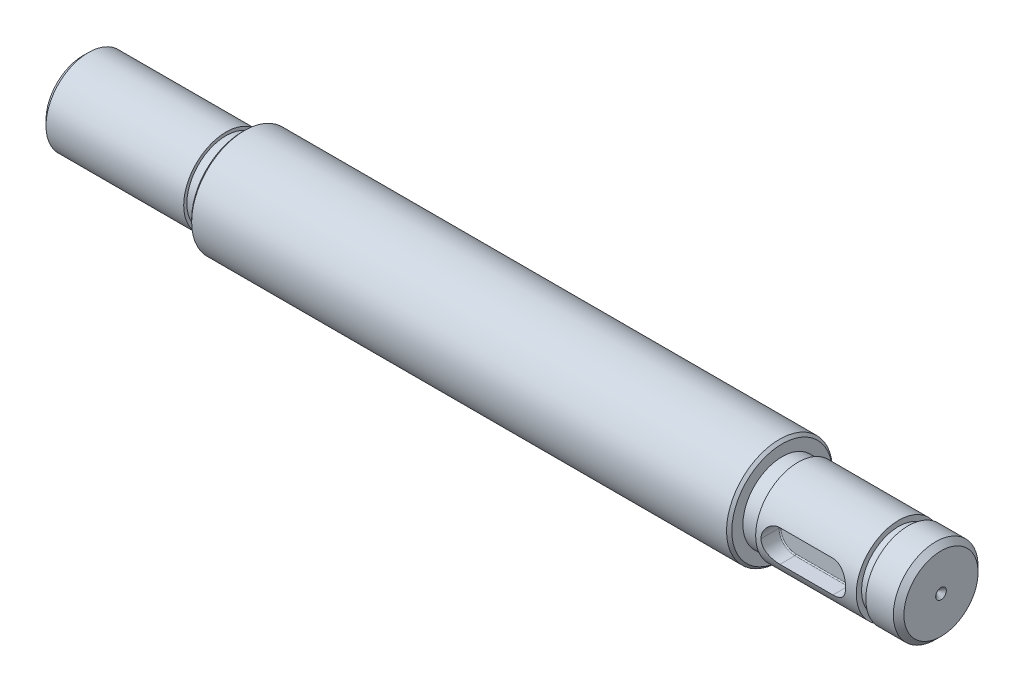
ISO-10303-21;
HEADER;
FILE_DESCRIPTION(('STEP AP214'),'2;1');
FILE_NAME('part.step','',(''),(''),'','','');
FILE_SCHEMA(('AUTOMOTIVE_DESIGN { 1 0 10303 214 1 1 1 1 }'));
ENDSEC;
DATA;
#1=APPLICATION_CONTEXT('core data for automotive mechanical design processes');
#2=APPLICATION_PROTOCOL_DEFINITION('international standard','automotive_design',2000,#1);
#3=PRODUCT_CONTEXT('',#1,'mechanical');
#4=PRODUCT('Part','Part','',(#3));
#5=PRODUCT_RELATED_PRODUCT_CATEGORY('part','',(#4));
#6=PRODUCT_DEFINITION_FORMATION('','',#4);
#7=PRODUCT_DEFINITION_CONTEXT('part definition',#1,'design');
#8=PRODUCT_DEFINITION('design','',#6,#7);
#9=PRODUCT_DEFINITION_SHAPE('','',#8);
#10=(LENGTH_UNIT() NAMED_UNIT(*) SI_UNIT(.MILLI.,.METRE.));
#11=(NAMED_UNIT(*) PLANE_ANGLE_UNIT() SI_UNIT($,.RADIAN.));
#12=(NAMED_UNIT(*) SI_UNIT($,.STERADIAN.) SOLID_ANGLE_UNIT());
#13=UNCERTAINTY_MEASURE_WITH_UNIT(LENGTH_MEASURE(1.E-05),#10,'distance_accuracy_value','');
#14=(GEOMETRIC_REPRESENTATION_CONTEXT(3) GLOBAL_UNCERTAINTY_ASSIGNED_CONTEXT((#13)) GLOBAL_UNIT_ASSIGNED_CONTEXT((#10,
#11,#12)) REPRESENTATION_CONTEXT('',''));
#15=CARTESIAN_POINT('',(0.,0.,0.));
#16=DIRECTION('',(0.,0.,1.));
#17=DIRECTION('',(1.,0.,0.));
#18=AXIS2_PLACEMENT_3D('',#15,#16,#17);
#19=CARTESIAN_POINT('',(0.,0.,0.));
#20=DIRECTION('',(-1.,0.,0.));
#21=DIRECTION('',(0.,0.,1.));
#22=AXIS2_PLACEMENT_3D('',#19,#20,#21);
#23=CYLINDRICAL_SURFACE('',#22,4.);
#24=CARTESIAN_POINT('',(77.,0.,0.));
#25=DIRECTION('',(1.,0.,0.));
#26=DIRECTION('',(0.,0.,-1.));
#27=AXIS2_PLACEMENT_3D('',#24,#25,#26);
#28=CIRCLE('',#27,4.);
#29=CARTESIAN_POINT('',(77.,0.,-4.));
#30=VERTEX_POINT('',#29);
#31=EDGE_CURVE('E365',#30,#30,#28,.T.);
#32=ORIENTED_EDGE('',*,*,#31,.F.);
#33=EDGE_LOOP('',(#32));
#34=FACE_BOUND('',#33,.T.);
#35=CARTESIAN_POINT('',(67.5,0.,0.));
#36=DIRECTION('',(-1.,0.,0.));
#37=DIRECTION('',(0.,0.,1.));
#38=AXIS2_PLACEMENT_3D('',#35,#36,#37);
#39=CIRCLE('',#38,4.);
#40=CARTESIAN_POINT('',(67.5,0.,4.));
#41=VERTEX_POINT('',#40);
#42=EDGE_CURVE('E302',#41,#41,#39,.T.);
#43=ORIENTED_EDGE('',*,*,#42,.F.);
#44=EDGE_LOOP('',(#43));
#45=FACE_BOUND('',#44,.T.);
#46=DIRECTION('',(-1.,0.,0.));
#47=VECTOR('',#46,1.);
#48=CARTESIAN_POINT('',(0.,-1.5,3.70809924354783));
#49=LINE('',#48,#47);
#50=CARTESIAN_POINT('',(74.5,-1.5,3.70809924354783));
#51=VERTEX_POINT('',#50);
#52=CARTESIAN_POINT('',(69.5,-1.5,3.70809924354783));
#53=VERTEX_POINT('',#52);
#54=EDGE_CURVE('E159',#51,#53,#49,.T.);
#55=ORIENTED_EDGE('',*,*,#54,.T.);
#56=CARTESIAN_POINT('',(69.5,-1.5,3.70809924354783));
#57=CARTESIAN_POINT('',(69.4594059305553,-1.50000149763685,3.70809443488223));
#58=CARTESIAN_POINT('',(69.4188329978994,-1.49835105709716,3.70876668409977));
#59=CARTESIAN_POINT('',(69.3380093568391,-1.49177843163965,3.71141698257091));
#60=CARTESIAN_POINT('',(69.2977585447945,-1.48685734569824,3.71339459320577));
#61=CARTESIAN_POINT('',(69.178226826317,-1.4672933482067,3.72119033682707));
#62=CARTESIAN_POINT('',(69.0997974497692,-1.44784901310297,3.72887225208868));
#63=CARTESIAN_POINT('',(68.9476339471668,-1.39690282812454,3.74825199333564));
#64=CARTESIAN_POINT('',(68.8738960111435,-1.3654109118427,3.75994650999365));
#65=CARTESIAN_POINT('',(68.7326690628725,-1.29134257885079,3.78602333377589));
#66=CARTESIAN_POINT('',(68.6651854708133,-1.24875666733343,3.80040794022651));
#67=CARTESIAN_POINT('',(68.5351088724607,-1.15146673631305,3.83103570457934));
#68=CARTESIAN_POINT('',(68.4728715264412,-1.09630444816551,3.84733331324471));
#69=CARTESIAN_POINT('',(68.3582775205832,-0.976395613097518,3.87949750401636));
#70=CARTESIAN_POINT('',(68.305923002106,-0.911646994469718,3.89536399207354));
#71=CARTESIAN_POINT('',(68.2108435774906,-0.771671110191599,3.92553400925355));
#72=CARTESIAN_POINT('',(68.1685118052143,-0.696160035999179,3.93976501267995));
#73=CARTESIAN_POINT('',(68.0973265968158,-0.538489868027632,3.9643883038365));
#74=CARTESIAN_POINT('',(68.0684589267465,-0.456337903183925,3.97478464304361));
#75=CARTESIAN_POINT('',(68.0313833692295,-0.311568360413164,3.98831063781509));
#76=CARTESIAN_POINT('',(68.0196498632232,-0.249946259701632,3.9926612104967));
#77=CARTESIAN_POINT('',(68.0039443418765,-0.125564806183785,3.99852089820637));
#78=CARTESIAN_POINT('',(67.9999755768709,-0.062804988216709,4.00002882328734));
#79=CARTESIAN_POINT('',(68.,0.,4.));
#80=B_SPLINE_CURVE_WITH_KNOTS('',3,(#56,#57,#58,#59,#60,#61,#62,#63,#64,#65,#66,#67,#68,#69,#70,
#71,#72,#73,#74,#75,#76,#77,#78,#79),.UNSPECIFIED.,.F.,.F.,(4,2,2,2,2,2,2,2,2,2,2,4),(0.,
0.121702070650527,0.243363268593937,0.485593089370354,0.727623613350256,0.969861963846899,
1.2229773776272,1.47614757238601,1.73802530937246,1.9996255640306,2.18773738057225,
2.37592792422954),.UNSPECIFIED.);
#81=CARTESIAN_POINT('',(68.,0.,4.));
#82=VERTEX_POINT('',#81);
#83=EDGE_CURVE('E214',#53,#82,#80,.T.);
#84=ORIENTED_EDGE('',*,*,#83,.T.);
#85=CARTESIAN_POINT('',(68.,0.,4.));
#86=CARTESIAN_POINT('',(67.9999987715417,0.0406958829842193,4.0000033265242));
#87=CARTESIAN_POINT('',(68.0016572436766,0.08137099541071,3.99937821643425));
#88=CARTESIAN_POINT('',(68.0082636148126,0.1624049821427,3.99690675065887));
#89=CARTESIAN_POINT('',(68.0132106231327,0.202763939083229,3.99506072565186));
#90=CARTESIAN_POINT('',(68.0328868689112,0.322658818153229,3.98776419542613));
#91=CARTESIAN_POINT('',(68.0524519115586,0.401351138250185,3.98055464040178));
#92=CARTESIAN_POINT('',(68.1037487278131,0.554057247937605,3.96219014943225));
#93=CARTESIAN_POINT('',(68.1354739160358,0.628073544622783,3.9510373492233));
#94=CARTESIAN_POINT('',(68.2100889205701,0.769768846215137,3.92589331480545));
#95=CARTESIAN_POINT('',(68.2529862089937,0.837443568408158,3.91190018231573));
#96=CARTESIAN_POINT('',(68.3506106720114,0.967344906860735,3.88186303805133));
#97=CARTESIAN_POINT('',(68.405725774499,1.02926635746347,3.86576126025821));
#98=CARTESIAN_POINT('',(68.5254061833372,1.14324026520414,3.83360332452306));
#99=CARTESIAN_POINT('',(68.5899750568823,1.19528897996651,3.8175471861438));
#100=CARTESIAN_POINT('',(68.7297458027433,1.2900021675008,3.78661824913521));
#101=CARTESIAN_POINT('',(68.805261304648,1.3322282773455,3.77181479391607));
#102=CARTESIAN_POINT('',(68.9629257096993,1.40321260233322,3.74598828763861));
#103=CARTESIAN_POINT('',(69.0450662174502,1.43198755826084,3.73496054207913));
#104=CARTESIAN_POINT('',(69.1895938732748,1.4688507799066,3.72058587751726));
#105=CARTESIAN_POINT('',(69.250966567495,1.4804930770667,3.71594709538589));
#106=CARTESIAN_POINT('',(69.3748756822457,1.49608314541372,3.7096837811096));
#107=CARTESIAN_POINT('',(69.4374129386371,1.50002515651037,3.70806150546337));
#108=CARTESIAN_POINT('',(69.5,1.5,3.70809924354783));
#109=B_SPLINE_CURVE_WITH_KNOTS('',3,(#85,#86,#87,#88,#89,#90,#91,#92,#93,#94,#95,#96,#97,#98,
#99,#100,#101,#102,#103,#104,#105,#106,#107,#108),.UNSPECIFIED.,.F.,.F.,(4,2,2,2,2,2,2,2,2,2,2,
4),(0.,0.122008525653371,0.243984019459629,0.486933412549048,0.729751420715084,
0.972732249088057,1.2249558748475,1.47727491867927,1.73930674597636,2.0010115846268,
2.18839922255605,2.37592697956525),.UNSPECIFIED.);
#110=CARTESIAN_POINT('',(69.5,1.5,3.70809924354783));
#111=VERTEX_POINT('',#110);
#112=EDGE_CURVE('E208',#82,#111,#109,.T.);
#113=ORIENTED_EDGE('',*,*,#112,.T.);
#114=DIRECTION('',(-1.,0.,0.));
#115=VECTOR('',#114,1.);
#116=CARTESIAN_POINT('',(0.,1.5,3.70809924354783));
#117=LINE('',#116,#115);
#118=CARTESIAN_POINT('',(74.5,1.5,3.70809924354783));
#119=VERTEX_POINT('',#118);
#120=EDGE_CURVE('E162',#111,#119,#117,.F.);
#121=ORIENTED_EDGE('',*,*,#120,.T.);
#122=CARTESIAN_POINT('',(74.5,1.5,3.70809924354783));
#123=CARTESIAN_POINT('',(74.5405940694447,1.50000149763685,3.70809443488223));
#124=CARTESIAN_POINT('',(74.5811670021006,1.49835105709716,3.70876668409977));
#125=CARTESIAN_POINT('',(74.6619906431609,1.49177843163965,3.71141698257091));
#126=CARTESIAN_POINT('',(74.7022414552056,1.48685734569824,3.71339459320577));
#127=CARTESIAN_POINT('',(74.821773173683,1.4672933482067,3.72119033682707));
#128=CARTESIAN_POINT('',(74.9002025502308,1.44784901310297,3.72887225208868));
#129=CARTESIAN_POINT('',(75.0523660528332,1.39690282812453,3.74825199333564));
#130=CARTESIAN_POINT('',(75.1261039888565,1.36541091184269,3.75994650999366));
#131=CARTESIAN_POINT('',(75.2673309371275,1.29134257885079,3.7860233337759));
#132=CARTESIAN_POINT('',(75.3348145291867,1.24875666733342,3.80040794022651));
#133=CARTESIAN_POINT('',(75.4648911275393,1.15146673631305,3.83103570457934));
#134=CARTESIAN_POINT('',(75.5271284735588,1.09630444816551,3.84733331324471));
#135=CARTESIAN_POINT('',(75.6417224794168,0.976395613097518,3.87949750401636));
#136=CARTESIAN_POINT('',(75.694076997894,0.911646994469717,3.89536399207354));
#137=CARTESIAN_POINT('',(75.7891564225094,0.771671110191596,3.92553400925355));
#138=CARTESIAN_POINT('',(75.8314881947857,0.696160035999174,3.93976501267995));
#139=CARTESIAN_POINT('',(75.9026734031842,0.538489868027627,3.9643883038365));
#140=CARTESIAN_POINT('',(75.9315410732535,0.456337903183921,3.97478464304361));
#141=CARTESIAN_POINT('',(75.9686166307705,0.311568360413164,3.98831063781509));
#142=CARTESIAN_POINT('',(75.9803501367768,0.249946259701633,3.9926612104967));
#143=CARTESIAN_POINT('',(75.9960556581235,0.125564806183786,3.99852089820637));
#144=CARTESIAN_POINT('',(76.0000244231291,0.0628049882167101,4.00002882328734));
#145=CARTESIAN_POINT('',(76.,0.,4.));
#146=B_SPLINE_CURVE_WITH_KNOTS('',3,(#122,#123,#124,#125,#126,#127,#128,#129,#130,#131,#132,
#133,#134,#135,#136,#137,#138,#139,#140,#141,#142,#143,#144,#145),.UNSPECIFIED.,.F.,.F.,(4,2,2,
2,2,2,2,2,2,2,2,4),(0.,0.12170207065054,0.243363268593951,0.485593089370354,0.727623613350272,
0.969861963846899,1.2229773776272,1.47614757238601,1.73802530937248,1.9996255640306,
2.18773738057225,2.37592792422954),.UNSPECIFIED.);
#147=CARTESIAN_POINT('',(76.,0.,4.));
#148=VERTEX_POINT('',#147);
#149=EDGE_CURVE('E169',#119,#148,#146,.T.);
#150=ORIENTED_EDGE('',*,*,#149,.T.);
#151=CARTESIAN_POINT('',(76.,0.,4.));
#152=CARTESIAN_POINT('',(76.0000012284583,-0.0406958829842188,4.0000033265242));
#153=CARTESIAN_POINT('',(75.9983427563234,-0.081370995410709,3.99937821643425));
#154=CARTESIAN_POINT('',(75.9917363851874,-0.162404982142699,3.99690675065887));
#155=CARTESIAN_POINT('',(75.9867893768673,-0.202763939083229,3.99506072565186));
#156=CARTESIAN_POINT('',(75.9671131310888,-0.322658818153229,3.98776419542613));
#157=CARTESIAN_POINT('',(75.9475480884414,-0.401351138250185,3.98055464040178));
#158=CARTESIAN_POINT('',(75.8962512721869,-0.554057247937611,3.96219014943225));
#159=CARTESIAN_POINT('',(75.8645260839642,-0.628073544622794,3.9510373492233));
#160=CARTESIAN_POINT('',(75.7899110794299,-0.769768846215147,3.92589331480545));
#161=CARTESIAN_POINT('',(75.7470137910063,-0.837443568408164,3.91190018231573));
#162=CARTESIAN_POINT('',(75.6493893279886,-0.967344906860733,3.88186303805133));
#163=CARTESIAN_POINT('',(75.594274225501,-1.02926635746347,3.86576126025821));
#164=CARTESIAN_POINT('',(75.4745938166628,-1.14324026520414,3.83360332452306));
#165=CARTESIAN_POINT('',(75.4100249431177,-1.19528897996651,3.8175471861438));
#166=CARTESIAN_POINT('',(75.2702541972567,-1.2900021675008,3.78661824913521));
#167=CARTESIAN_POINT('',(75.194738695352,-1.3322282773455,3.77181479391607));
#168=CARTESIAN_POINT('',(75.0370742903007,-1.40321260233322,3.74598828763861));
#169=CARTESIAN_POINT('',(74.9549337825498,-1.43198755826084,3.73496054207913));
#170=CARTESIAN_POINT('',(74.8104061267252,-1.4688507799066,3.72058587751726));
#171=CARTESIAN_POINT('',(74.749033432505,-1.4804930770667,3.71594709538589));
#172=CARTESIAN_POINT('',(74.6251243177543,-1.49608314541372,3.7096837811096));
#173=CARTESIAN_POINT('',(74.5625870613629,-1.50002515651037,3.70806150546337));
#174=CARTESIAN_POINT('',(74.5,-1.5,3.70809924354783));
#175=B_SPLINE_CURVE_WITH_KNOTS('',3,(#151,#152,#153,#154,#155,#156,#157,#158,#159,#160,#161,
#162,#163,#164,#165,#166,#167,#168,#169,#170,#171,#172,#173,#174),.UNSPECIFIED.,.F.,.F.,(4,2,2,
2,2,2,2,2,2,2,2,4),(0.,0.12200852565337,0.243984019459629,0.486933412549048,0.729751420715105,
0.972732249088057,1.2249558748475,1.47727491867927,1.73930674597636,2.0010115846268,
2.18839922255604,2.37592697956525),.UNSPECIFIED.);
#176=EDGE_CURVE('E177',#148,#51,#175,.T.);
#177=ORIENTED_EDGE('',*,*,#176,.T.);
#178=EDGE_LOOP('',(#55,#84,#113,#121,#150,#177));
#179=FACE_BOUND('',#178,.T.);
#180=ADVANCED_FACE('F38',(#34,#45,#179),#23,.T.);
#181=CARTESIAN_POINT('',(66.,4.75,0.));
#182=DIRECTION('',(-1.,0.,0.));
#183=DIRECTION('',(0.,0.,1.));
#184=AXIS2_PLACEMENT_3D('',#181,#182,#183);
#185=PLANE('',#184);
#186=CARTESIAN_POINT('',(66.,0.,0.));
#187=DIRECTION('',(-1.,0.,0.));
#188=DIRECTION('',(0.,0.,1.));
#189=AXIS2_PLACEMENT_3D('',#186,#187,#188);
#190=CIRCLE('',#189,4.75);
#191=CARTESIAN_POINT('',(66.,0.,4.75));
#192=VERTEX_POINT('',#191);
#193=EDGE_CURVE('E144',#192,#192,#190,.T.);
#194=ORIENTED_EDGE('',*,*,#193,.F.);
#195=EDGE_LOOP('',(#194));
#196=FACE_BOUND('',#195,.T.);
#197=CARTESIAN_POINT('',(66.,0.,0.));
#198=DIRECTION('',(-1.,0.,0.));
#199=DIRECTION('',(0.,0.,1.));
#200=AXIS2_PLACEMENT_3D('',#197,#198,#199);
#201=CIRCLE('',#200,3.7);
#202=CARTESIAN_POINT('',(66.,0.,3.7));
#203=VERTEX_POINT('',#202);
#204=EDGE_CURVE('E309',#203,#203,#201,.T.);
#205=ORIENTED_EDGE('',*,*,#204,.T.);
#206=EDGE_LOOP('',(#205));
#207=FACE_BOUND('',#206,.T.);
#208=ADVANCED_FACE('F341',(#196,#207),#185,.F.);
#209=CARTESIAN_POINT('',(66.,0.,0.));
#210=DIRECTION('',(-1.,0.,0.));
#211=DIRECTION('',(0.,0.,1.));
#212=AXIS2_PLACEMENT_3D('',#209,#210,#211);
#213=CONICAL_SURFACE('',#212,4.75,0.785398163397448);
#214=CARTESIAN_POINT('',(65.75,0.,0.));
#215=DIRECTION('',(-1.,0.,0.));
#216=DIRECTION('',(0.,0.,1.));
#217=AXIS2_PLACEMENT_3D('',#214,#215,#216);
#218=CIRCLE('',#217,5.);
#219=CARTESIAN_POINT('',(65.75,0.,5.));
#220=VERTEX_POINT('',#219);
#221=EDGE_CURVE('E141',#220,#220,#218,.T.);
#222=ORIENTED_EDGE('',*,*,#221,.F.);
#223=EDGE_LOOP('',(#222));
#224=FACE_BOUND('',#223,.T.);
#225=ORIENTED_EDGE('',*,*,#193,.T.);
#226=EDGE_LOOP('',(#225));
#227=FACE_BOUND('',#226,.T.);
#228=ADVANCED_FACE('F346',(#224,#227),#213,.T.);
#229=CARTESIAN_POINT('',(0.,0.,0.));
#230=DIRECTION('',(-1.,0.,0.));
#231=DIRECTION('',(0.,0.,1.));
#232=AXIS2_PLACEMENT_3D('',#229,#230,#231);
#233=CYLINDRICAL_SURFACE('',#232,5.);
#234=CARTESIAN_POINT('',(15.25,0.,0.));
#235=DIRECTION('',(-1.,0.,0.));
#236=DIRECTION('',(0.,0.,1.));
#237=AXIS2_PLACEMENT_3D('',#234,#235,#236);
#238=CIRCLE('',#237,5.);
#239=CARTESIAN_POINT('',(15.25,0.,5.));
#240=VERTEX_POINT('',#239);
#241=EDGE_CURVE('E138',#240,#240,#238,.T.);
#242=ORIENTED_EDGE('',*,*,#241,.F.);
#243=EDGE_LOOP('',(#242));
#244=FACE_BOUND('',#243,.T.);
#245=ORIENTED_EDGE('',*,*,#221,.T.);
#246=EDGE_LOOP('',(#245));
#247=FACE_BOUND('',#246,.T.);
#248=ADVANCED_FACE('F336',(#244,#247),#233,.T.);
#249=CARTESIAN_POINT('',(15.25,0.,0.));
#250=DIRECTION('',(1.,0.,0.));
#251=DIRECTION('',(0.,0.,-1.));
#252=AXIS2_PLACEMENT_3D('',#249,#250,#251);
#253=CONICAL_SURFACE('',#252,5.,0.785398163397448);
#254=CARTESIAN_POINT('',(15.,0.,0.));
#255=DIRECTION('',(-1.,0.,0.));
#256=DIRECTION('',(0.,0.,1.));
#257=AXIS2_PLACEMENT_3D('',#254,#255,#256);
#258=CIRCLE('',#257,4.75);
#259=CARTESIAN_POINT('',(15.,0.,4.75));
#260=VERTEX_POINT('',#259);
#261=EDGE_CURVE('E129',#260,#260,#258,.T.);
#262=ORIENTED_EDGE('',*,*,#261,.F.);
#263=EDGE_LOOP('',(#262));
#264=FACE_BOUND('',#263,.T.);
#265=ORIENTED_EDGE('',*,*,#241,.T.);
#266=EDGE_LOOP('',(#265));
#267=FACE_BOUND('',#266,.T.);
#268=ADVANCED_FACE('F327',(#264,#267),#253,.T.);
#269=CARTESIAN_POINT('',(15.,4.,0.));
#270=DIRECTION('',(1.,0.,0.));
#271=DIRECTION('',(0.,0.,-1.));
#272=AXIS2_PLACEMENT_3D('',#269,#270,#271);
#273=PLANE('',#272);
#274=ORIENTED_EDGE('',*,*,#261,.T.);
#275=EDGE_LOOP('',(#274));
#276=FACE_BOUND('',#275,.T.);
#277=CARTESIAN_POINT('',(15.,0.,0.));
#278=DIRECTION('',(-1.,0.,0.));
#279=DIRECTION('',(0.,0.,1.));
#280=AXIS2_PLACEMENT_3D('',#277,#278,#279);
#281=CIRCLE('',#280,3.7);
#282=CARTESIAN_POINT('',(15.,0.,3.7));
#283=VERTEX_POINT('',#282);
#284=EDGE_CURVE('E132',#283,#283,#281,.T.);
#285=ORIENTED_EDGE('',*,*,#284,.F.);
#286=EDGE_LOOP('',(#285));
#287=FACE_BOUND('',#286,.T.);
#288=ADVANCED_FACE('F324',(#276,#287),#273,.F.);
#289=CARTESIAN_POINT('',(13.5,4.,0.));
#290=DIRECTION('',(1.,0.,0.));
#291=DIRECTION('',(0.,0.,-1.));
#292=AXIS2_PLACEMENT_3D('',#289,#290,#291);
#293=PLANE('',#292);
#294=CARTESIAN_POINT('',(13.5,0.,0.));
#295=DIRECTION('',(-1.,0.,0.));
#296=DIRECTION('',(0.,0.,1.));
#297=AXIS2_PLACEMENT_3D('',#294,#295,#296);
#298=CIRCLE('',#297,3.7);
#299=CARTESIAN_POINT('',(13.5,0.,3.7));
#300=VERTEX_POINT('',#299);
#301=EDGE_CURVE('E126',#300,#300,#298,.T.);
#302=ORIENTED_EDGE('',*,*,#301,.T.);
#303=EDGE_LOOP('',(#302));
#304=FACE_BOUND('',#303,.T.);
#305=CARTESIAN_POINT('',(13.5,0.,0.));
#306=DIRECTION('',(-1.,0.,0.));
#307=DIRECTION('',(0.,0.,1.));
#308=AXIS2_PLACEMENT_3D('',#305,#306,#307);
#309=CIRCLE('',#308,4.);
#310=CARTESIAN_POINT('',(13.5,0.,4.));
#311=VERTEX_POINT('',#310);
#312=EDGE_CURVE('E316',#311,#311,#309,.T.);
#313=ORIENTED_EDGE('',*,*,#312,.F.);
#314=EDGE_LOOP('',(#313));
#315=FACE_BOUND('',#314,.T.);
#316=ADVANCED_FACE('F326',(#304,#315),#293,.T.);
#317=CARTESIAN_POINT('',(0.,0.,0.));
#318=DIRECTION('',(-1.,0.,0.));
#319=DIRECTION('',(0.,0.,1.));
#320=AXIS2_PLACEMENT_3D('',#317,#318,#319);
#321=CYLINDRICAL_SURFACE('',#320,3.7);
#322=ORIENTED_EDGE('',*,*,#284,.T.);
#323=EDGE_LOOP('',(#322));
#324=FACE_BOUND('',#323,.T.);
#325=ORIENTED_EDGE('',*,*,#301,.F.);
#326=EDGE_LOOP('',(#325));
#327=FACE_BOUND('',#326,.T.);
#328=ADVANCED_FACE('F321',(#324,#327),#321,.T.);
#329=CARTESIAN_POINT('',(0.5,0.,0.));
#330=DIRECTION('',(-1.,0.,0.));
#331=DIRECTION('',(0.,0.,1.));
#332=AXIS2_PLACEMENT_3D('',#329,#330,#331);
#333=CONICAL_SURFACE('',#332,0.,0.785398163397448);
#334=CARTESIAN_POINT('',(0.,0.,0.));
#335=DIRECTION('',(-1.,0.,0.));
#336=DIRECTION('',(0.,0.,1.));
#337=AXIS2_PLACEMENT_3D('',#334,#335,#336);
#338=CIRCLE('',#337,0.5);
#339=CARTESIAN_POINT('',(0.,0.,0.5));
#340=VERTEX_POINT('',#339);
#341=EDGE_CURVE('E125',#340,#340,#338,.T.);
#342=ORIENTED_EDGE('',*,*,#341,.T.);
#343=EDGE_LOOP('',(#342));
#344=FACE_BOUND('',#343,.T.);
#345=CARTESIAN_POINT('',(0.5,0.,0.));
#346=VERTEX_POINT('',#345);
#347=VERTEX_LOOP('',#346);
#348=FACE_BOUND('',#347,.T.);
#349=ADVANCED_FACE('F402',(#344,#348),#333,.F.);
#350=CARTESIAN_POINT('',(0.,4.,0.));
#351=DIRECTION('',(1.,0.,0.));
#352=DIRECTION('',(0.,0.,-1.));
#353=AXIS2_PLACEMENT_3D('',#350,#351,#352);
#354=PLANE('',#353);
#355=CARTESIAN_POINT('',(0.,0.,0.));
#356=DIRECTION('',(1.,0.,0.));
#357=DIRECTION('',(0.,0.,-1.));
#358=AXIS2_PLACEMENT_3D('',#355,#356,#357);
#359=CIRCLE('',#358,3.50000000000002);
#360=CARTESIAN_POINT('',(0.,0.,-3.50000000000002));
#361=VERTEX_POINT('',#360);
#362=EDGE_CURVE('E153',#361,#361,#359,.F.);
#363=ORIENTED_EDGE('',*,*,#362,.T.);
#364=EDGE_LOOP('',(#363));
#365=FACE_BOUND('',#364,.T.);
#366=ORIENTED_EDGE('',*,*,#341,.F.);
#367=EDGE_LOOP('',(#366));
#368=FACE_BOUND('',#367,.T.);
#369=ADVANCED_FACE('F406',(#365,#368),#354,.F.);
#370=CARTESIAN_POINT('',(0.,0.,0.));
#371=DIRECTION('',(1.,0.,0.));
#372=DIRECTION('',(0.,0.,-1.));
#373=AXIS2_PLACEMENT_3D('',#370,#371,#372);
#374=CONICAL_SURFACE('',#373,3.50000000000002,0.785398163397434);
#375=CARTESIAN_POINT('',(0.499999999999997,0.,0.));
#376=DIRECTION('',(1.,0.,0.));
#377=DIRECTION('',(0.,0.,-1.));
#378=AXIS2_PLACEMENT_3D('',#375,#376,#377);
#379=CIRCLE('',#378,4.);
#380=CARTESIAN_POINT('',(0.499999999999997,0.,-4.));
#381=VERTEX_POINT('',#380);
#382=EDGE_CURVE('E156',#381,#381,#379,.T.);
#383=ORIENTED_EDGE('',*,*,#382,.F.);
#384=EDGE_LOOP('',(#383));
#385=FACE_BOUND('',#384,.T.);
#386=ORIENTED_EDGE('',*,*,#362,.F.);
#387=EDGE_LOOP('',(#386));
#388=FACE_BOUND('',#387,.T.);
#389=ADVANCED_FACE('F194',(#385,#388),#374,.T.);
#390=CARTESIAN_POINT('',(0.,0.,0.));
#391=DIRECTION('',(-1.,0.,0.));
#392=DIRECTION('',(0.,0.,1.));
#393=AXIS2_PLACEMENT_3D('',#390,#391,#392);
#394=CYLINDRICAL_SURFACE('',#393,4.);
#395=ORIENTED_EDGE('',*,*,#382,.T.);
#396=EDGE_LOOP('',(#395));
#397=FACE_BOUND('',#396,.T.);
#398=ORIENTED_EDGE('',*,*,#312,.T.);
#399=EDGE_LOOP('',(#398));
#400=FACE_BOUND('',#399,.T.);
#401=ADVANCED_FACE('F399',(#397,#400),#394,.T.);
#402=CARTESIAN_POINT('',(0.,0.,0.));
#403=DIRECTION('',(-1.,0.,0.));
#404=DIRECTION('',(0.,0.,1.));
#405=AXIS2_PLACEMENT_3D('',#402,#403,#404);
#406=CYLINDRICAL_SURFACE('',#405,3.7);
#407=CARTESIAN_POINT('',(67.5,0.,0.));
#408=DIRECTION('',(-1.,0.,0.));
#409=DIRECTION('',(0.,0.,1.));
#410=AXIS2_PLACEMENT_3D('',#407,#408,#409);
#411=CIRCLE('',#410,3.7);
#412=CARTESIAN_POINT('',(67.5,0.,3.7));
#413=VERTEX_POINT('',#412);
#414=EDGE_CURVE('E304',#413,#413,#411,.T.);
#415=ORIENTED_EDGE('',*,*,#414,.T.);
#416=EDGE_LOOP('',(#415));
#417=FACE_BOUND('',#416,.T.);
#418=ORIENTED_EDGE('',*,*,#204,.F.);
#419=EDGE_LOOP('',(#418));
#420=FACE_BOUND('',#419,.T.);
#421=ADVANCED_FACE('F396',(#417,#420),#406,.T.);
#422=CARTESIAN_POINT('',(67.5,4.,0.));
#423=DIRECTION('',(-1.,0.,0.));
#424=DIRECTION('',(0.,0.,1.));
#425=AXIS2_PLACEMENT_3D('',#422,#423,#424);
#426=PLANE('',#425);
#427=ORIENTED_EDGE('',*,*,#42,.T.);
#428=EDGE_LOOP('',(#427));
#429=FACE_BOUND('',#428,.T.);
#430=ORIENTED_EDGE('',*,*,#414,.F.);
#431=EDGE_LOOP('',(#430));
#432=FACE_BOUND('',#431,.T.);
#433=ADVANCED_FACE('F391',(#429,#432),#426,.T.);
#434=CARTESIAN_POINT('',(68.,1.5,2.2));
#435=DIRECTION('',(0.,1.,0.));
#436=DIRECTION('',(0.,0.,1.));
#437=AXIS2_PLACEMENT_3D('',#434,#435,#436);
#438=PLANE('',#437);
#439=DIRECTION('',(0.,0.,1.));
#440=VECTOR('',#439,1.);
#441=CARTESIAN_POINT('',(69.5,1.5,2.2));
#442=LINE('',#441,#440);
#443=CARTESIAN_POINT('',(69.5,1.5,2.3));
#444=VERTEX_POINT('',#443);
#445=EDGE_CURVE('E297',#111,#444,#442,.F.);
#446=ORIENTED_EDGE('',*,*,#445,.T.);
#447=DIRECTION('',(-1.,0.,0.));
#448=VECTOR('',#447,1.);
#449=CARTESIAN_POINT('',(68.,1.5,2.3));
#450=LINE('',#449,#448);
#451=CARTESIAN_POINT('',(74.5,1.5,2.3));
#452=VERTEX_POINT('',#451);
#453=EDGE_CURVE('E241',#444,#452,#450,.F.);
#454=ORIENTED_EDGE('',*,*,#453,.T.);
#455=DIRECTION('',(0.,0.,1.));
#456=VECTOR('',#455,1.);
#457=CARTESIAN_POINT('',(74.5,1.5,3.70809924354783));
#458=LINE('',#457,#456);
#459=EDGE_CURVE('E165',#452,#119,#458,.T.);
#460=ORIENTED_EDGE('',*,*,#459,.T.);
#461=ORIENTED_EDGE('',*,*,#120,.F.);
#462=EDGE_LOOP('',(#446,#454,#460,#461));
#463=FACE_BOUND('',#462,.T.);
#464=ADVANCED_FACE('F295',(#463),#438,.F.);
#465=CARTESIAN_POINT('',(68.,-1.5,2.2));
#466=DIRECTION('',(0.,-1.,0.));
#467=DIRECTION('',(0.,0.,-1.));
#468=AXIS2_PLACEMENT_3D('',#465,#466,#467);
#469=PLANE('',#468);
#470=DIRECTION('',(0.,0.,1.));
#471=VECTOR('',#470,1.);
#472=CARTESIAN_POINT('',(74.5,-1.5,2.2));
#473=LINE('',#472,#471);
#474=CARTESIAN_POINT('',(74.5,-1.5,2.3));
#475=VERTEX_POINT('',#474);
#476=EDGE_CURVE('E167',#51,#475,#473,.F.);
#477=ORIENTED_EDGE('',*,*,#476,.T.);
#478=DIRECTION('',(1.,0.,0.));
#479=VECTOR('',#478,1.);
#480=CARTESIAN_POINT('',(68.,-1.5,2.3));
#481=LINE('',#480,#479);
#482=CARTESIAN_POINT('',(69.5,-1.5,2.3));
#483=VERTEX_POINT('',#482);
#484=EDGE_CURVE('E47',#475,#483,#481,.F.);
#485=ORIENTED_EDGE('',*,*,#484,.T.);
#486=DIRECTION('',(0.,0.,1.));
#487=VECTOR('',#486,1.);
#488=CARTESIAN_POINT('',(69.5,-1.5,3.70809924354783));
#489=LINE('',#488,#487);
#490=EDGE_CURVE('E215',#483,#53,#489,.T.);
#491=ORIENTED_EDGE('',*,*,#490,.T.);
#492=ORIENTED_EDGE('',*,*,#54,.F.);
#493=EDGE_LOOP('',(#477,#485,#491,#492));
#494=FACE_BOUND('',#493,.T.);
#495=ADVANCED_FACE('F387',(#494),#469,.F.);
#496=CARTESIAN_POINT('',(0.,0.,2.2));
#497=DIRECTION('',(0.,0.,1.));
#498=DIRECTION('',(1.,0.,0.));
#499=AXIS2_PLACEMENT_3D('',#496,#497,#498);
#500=PLANE('',#499);
#501=DIRECTION('',(-1.,0.,0.));
#502=VECTOR('',#501,1.);
#503=CARTESIAN_POINT('',(0.,1.4,2.2));
#504=LINE('',#503,#502);
#505=CARTESIAN_POINT('',(74.5,1.4,2.2));
#506=VERTEX_POINT('',#505);
#507=CARTESIAN_POINT('',(69.5,1.4,2.2));
#508=VERTEX_POINT('',#507);
#509=EDGE_CURVE('E233',#506,#508,#504,.T.);
#510=ORIENTED_EDGE('',*,*,#509,.T.);
#511=CARTESIAN_POINT('',(69.5,0.,2.2));
#512=DIRECTION('',(0.,0.,1.));
#513=DIRECTION('',(1.,0.,0.));
#514=AXIS2_PLACEMENT_3D('',#511,#512,#513);
#515=CIRCLE('',#514,1.4);
#516=CARTESIAN_POINT('',(68.1,0.,2.2));
#517=VERTEX_POINT('',#516);
#518=EDGE_CURVE('E235',#508,#517,#515,.T.);
#519=ORIENTED_EDGE('',*,*,#518,.T.);
#520=CARTESIAN_POINT('',(69.5,0.,2.2));
#521=DIRECTION('',(0.,0.,1.));
#522=DIRECTION('',(1.,0.,0.));
#523=AXIS2_PLACEMENT_3D('',#520,#521,#522);
#524=CIRCLE('',#523,1.4);
#525=CARTESIAN_POINT('',(69.5,-1.4,2.2));
#526=VERTEX_POINT('',#525);
#527=EDGE_CURVE('E221',#517,#526,#524,.T.);
#528=ORIENTED_EDGE('',*,*,#527,.T.);
#529=DIRECTION('',(1.,0.,0.));
#530=VECTOR('',#529,1.);
#531=CARTESIAN_POINT('',(0.,-1.4,2.2));
#532=LINE('',#531,#530);
#533=CARTESIAN_POINT('',(74.5,-1.4,2.2));
#534=VERTEX_POINT('',#533);
#535=EDGE_CURVE('E227',#526,#534,#532,.T.);
#536=ORIENTED_EDGE('',*,*,#535,.T.);
#537=CARTESIAN_POINT('',(74.5,0.,2.2));
#538=DIRECTION('',(0.,0.,1.));
#539=DIRECTION('',(1.,0.,0.));
#540=AXIS2_PLACEMENT_3D('',#537,#538,#539);
#541=CIRCLE('',#540,1.4);
#542=CARTESIAN_POINT('',(75.9,0.,2.2));
#543=VERTEX_POINT('',#542);
#544=EDGE_CURVE('E229',#534,#543,#541,.T.);
#545=ORIENTED_EDGE('',*,*,#544,.T.);
#546=CARTESIAN_POINT('',(74.5,0.,2.2));
#547=DIRECTION('',(0.,0.,1.));
#548=DIRECTION('',(1.,0.,0.));
#549=AXIS2_PLACEMENT_3D('',#546,#547,#548);
#550=CIRCLE('',#549,1.4);
#551=EDGE_CURVE('E231',#543,#506,#550,.T.);
#552=ORIENTED_EDGE('',*,*,#551,.T.);
#553=EDGE_LOOP('',(#510,#519,#528,#536,#545,#552));
#554=FACE_BOUND('',#553,.T.);
#555=ADVANCED_FACE('F199',(#554),#500,.T.);
#556=CARTESIAN_POINT('',(74.5,0.,2.2));
#557=DIRECTION('',(0.,0.,-1.));
#558=DIRECTION('',(-1.,0.,0.));
#559=AXIS2_PLACEMENT_3D('',#556,#557,#558);
#560=CYLINDRICAL_SURFACE('',#559,1.5);
#561=DIRECTION('',(0.,0.,1.));
#562=VECTOR('',#561,1.);
#563=CARTESIAN_POINT('',(76.,0.,3.70809924354783));
#564=LINE('',#563,#562);
#565=CARTESIAN_POINT('',(76.,0.,2.3));
#566=VERTEX_POINT('',#565);
#567=EDGE_CURVE('E225',#566,#148,#564,.T.);
#568=ORIENTED_EDGE('',*,*,#567,.F.);
#569=CARTESIAN_POINT('',(74.5,0.,2.3));
#570=DIRECTION('',(0.,0.,1.));
#571=DIRECTION('',(1.,0.,0.));
#572=AXIS2_PLACEMENT_3D('',#569,#570,#571);
#573=CIRCLE('',#572,1.5);
#574=EDGE_CURVE('E62',#566,#475,#573,.F.);
#575=ORIENTED_EDGE('',*,*,#574,.T.);
#576=ORIENTED_EDGE('',*,*,#476,.F.);
#577=ORIENTED_EDGE('',*,*,#176,.F.);
#578=EDGE_LOOP('',(#568,#575,#576,#577));
#579=FACE_BOUND('',#578,.T.);
#580=ADVANCED_FACE('F192',(#579),#560,.F.);
#581=CARTESIAN_POINT('',(74.5,0.,2.2));
#582=DIRECTION('',(0.,0.,-1.));
#583=DIRECTION('',(-1.,0.,0.));
#584=AXIS2_PLACEMENT_3D('',#581,#582,#583);
#585=CYLINDRICAL_SURFACE('',#584,1.5);
#586=ORIENTED_EDGE('',*,*,#459,.F.);
#587=CARTESIAN_POINT('',(74.5,0.,2.3));
#588=DIRECTION('',(0.,0.,1.));
#589=DIRECTION('',(1.,0.,0.));
#590=AXIS2_PLACEMENT_3D('',#587,#588,#589);
#591=CIRCLE('',#590,1.5);
#592=EDGE_CURVE('E243',#452,#566,#591,.F.);
#593=ORIENTED_EDGE('',*,*,#592,.T.);
#594=ORIENTED_EDGE('',*,*,#567,.T.);
#595=ORIENTED_EDGE('',*,*,#149,.F.);
#596=EDGE_LOOP('',(#586,#593,#594,#595));
#597=FACE_BOUND('',#596,.T.);
#598=ADVANCED_FACE('F187',(#597),#585,.F.);
#599=CARTESIAN_POINT('',(69.5,0.,2.2));
#600=DIRECTION('',(0.,0.,-1.));
#601=DIRECTION('',(-1.,0.,0.));
#602=AXIS2_PLACEMENT_3D('',#599,#600,#601);
#603=CYLINDRICAL_SURFACE('',#602,1.5);
#604=ORIENTED_EDGE('',*,*,#490,.F.);
#605=CARTESIAN_POINT('',(69.5,0.,2.3));
#606=DIRECTION('',(0.,0.,1.));
#607=DIRECTION('',(1.,0.,0.));
#608=AXIS2_PLACEMENT_3D('',#605,#606,#607);
#609=CIRCLE('',#608,1.5);
#610=CARTESIAN_POINT('',(68.,0.,2.3));
#611=VERTEX_POINT('',#610);
#612=EDGE_CURVE('E12',#483,#611,#609,.F.);
#613=ORIENTED_EDGE('',*,*,#612,.T.);
#614=DIRECTION('',(0.,0.,1.));
#615=VECTOR('',#614,1.);
#616=CARTESIAN_POINT('',(68.,0.,2.2));
#617=LINE('',#616,#615);
#618=EDGE_CURVE('E222',#82,#611,#617,.F.);
#619=ORIENTED_EDGE('',*,*,#618,.F.);
#620=ORIENTED_EDGE('',*,*,#83,.F.);
#621=EDGE_LOOP('',(#604,#613,#619,#620));
#622=FACE_BOUND('',#621,.T.);
#623=ADVANCED_FACE('F191',(#622),#603,.F.);
#624=CARTESIAN_POINT('',(69.5,0.,2.2));
#625=DIRECTION('',(0.,0.,-1.));
#626=DIRECTION('',(-1.,0.,0.));
#627=AXIS2_PLACEMENT_3D('',#624,#625,#626);
#628=CYLINDRICAL_SURFACE('',#627,1.5);
#629=ORIENTED_EDGE('',*,*,#618,.T.);
#630=CARTESIAN_POINT('',(69.5,0.,2.3));
#631=DIRECTION('',(0.,0.,1.));
#632=DIRECTION('',(1.,0.,0.));
#633=AXIS2_PLACEMENT_3D('',#630,#631,#632);
#634=CIRCLE('',#633,1.5);
#635=EDGE_CURVE('E238',#611,#444,#634,.F.);
#636=ORIENTED_EDGE('',*,*,#635,.T.);
#637=ORIENTED_EDGE('',*,*,#445,.F.);
#638=ORIENTED_EDGE('',*,*,#112,.F.);
#639=EDGE_LOOP('',(#629,#636,#637,#638));
#640=FACE_BOUND('',#639,.T.);
#641=ADVANCED_FACE('F200',(#640),#628,.F.);
#642=CARTESIAN_POINT('',(74.5,0.,2.3));
#643=DIRECTION('',(0.,0.,1.));
#644=DIRECTION('',(1.,0.,0.));
#645=AXIS2_PLACEMENT_3D('',#642,#643,#644);
#646=TOROIDAL_SURFACE('',#645,1.4,0.1);
#647=CARTESIAN_POINT('',(74.5,-1.4,2.3));
#648=DIRECTION('',(1.,0.,0.));
#649=DIRECTION('',(0.,0.,-1.));
#650=AXIS2_PLACEMENT_3D('',#647,#648,#649);
#651=CIRCLE('',#650,0.1);
#652=EDGE_CURVE('E257',#475,#534,#651,.T.);
#653=ORIENTED_EDGE('',*,*,#652,.F.);
#654=ORIENTED_EDGE('',*,*,#574,.F.);
#655=CARTESIAN_POINT('',(75.9,0.,2.3));
#656=DIRECTION('',(0.,-1.,0.));
#657=DIRECTION('',(0.,0.,-1.));
#658=AXIS2_PLACEMENT_3D('',#655,#656,#657);
#659=CIRCLE('',#658,0.1);
#660=EDGE_CURVE('E42',#543,#566,#659,.T.);
#661=ORIENTED_EDGE('',*,*,#660,.F.);
#662=ORIENTED_EDGE('',*,*,#544,.F.);
#663=EDGE_LOOP('',(#653,#654,#661,#662));
#664=FACE_BOUND('',#663,.T.);
#665=ADVANCED_FACE('F40',(#664),#646,.F.);
#666=CARTESIAN_POINT('',(74.5,0.,2.3));
#667=DIRECTION('',(0.,0.,1.));
#668=DIRECTION('',(1.,0.,0.));
#669=AXIS2_PLACEMENT_3D('',#666,#667,#668);
#670=TOROIDAL_SURFACE('',#669,1.4,0.1);
#671=ORIENTED_EDGE('',*,*,#660,.T.);
#672=ORIENTED_EDGE('',*,*,#592,.F.);
#673=CARTESIAN_POINT('',(74.5,1.4,2.3));
#674=DIRECTION('',(1.,0.,0.));
#675=DIRECTION('',(0.,0.,-1.));
#676=AXIS2_PLACEMENT_3D('',#673,#674,#675);
#677=CIRCLE('',#676,0.1);
#678=EDGE_CURVE('E255',#506,#452,#677,.T.);
#679=ORIENTED_EDGE('',*,*,#678,.F.);
#680=ORIENTED_EDGE('',*,*,#551,.F.);
#681=EDGE_LOOP('',(#671,#672,#679,#680));
#682=FACE_BOUND('',#681,.T.);
#683=ADVANCED_FACE('F267',(#682),#670,.F.);
#684=CARTESIAN_POINT('',(0.,-1.4,2.3));
#685=DIRECTION('',(1.,0.,0.));
#686=DIRECTION('',(0.,0.,-1.));
#687=AXIS2_PLACEMENT_3D('',#684,#685,#686);
#688=CYLINDRICAL_SURFACE('',#687,0.1);
#689=ORIENTED_EDGE('',*,*,#652,.T.);
#690=ORIENTED_EDGE('',*,*,#535,.F.);
#691=CARTESIAN_POINT('',(69.5,-1.4,2.3));
#692=DIRECTION('',(1.,0.,0.));
#693=DIRECTION('',(0.,0.,-1.));
#694=AXIS2_PLACEMENT_3D('',#691,#692,#693);
#695=CIRCLE('',#694,0.1);
#696=EDGE_CURVE('E252',#483,#526,#695,.T.);
#697=ORIENTED_EDGE('',*,*,#696,.F.);
#698=ORIENTED_EDGE('',*,*,#484,.F.);
#699=EDGE_LOOP('',(#689,#690,#697,#698));
#700=FACE_BOUND('',#699,.T.);
#701=ADVANCED_FACE('F272',(#700),#688,.F.);
#702=CARTESIAN_POINT('',(0.,1.4,2.3));
#703=DIRECTION('',(-1.,0.,0.));
#704=DIRECTION('',(0.,0.,1.));
#705=AXIS2_PLACEMENT_3D('',#702,#703,#704);
#706=CYLINDRICAL_SURFACE('',#705,0.1);
#707=ORIENTED_EDGE('',*,*,#678,.T.);
#708=ORIENTED_EDGE('',*,*,#453,.F.);
#709=CARTESIAN_POINT('',(69.5,1.4,2.3));
#710=DIRECTION('',(1.,0.,0.));
#711=DIRECTION('',(0.,0.,-1.));
#712=AXIS2_PLACEMENT_3D('',#709,#710,#711);
#713=CIRCLE('',#712,0.1);
#714=EDGE_CURVE('E249',#508,#444,#713,.T.);
#715=ORIENTED_EDGE('',*,*,#714,.F.);
#716=ORIENTED_EDGE('',*,*,#509,.F.);
#717=EDGE_LOOP('',(#707,#708,#715,#716));
#718=FACE_BOUND('',#717,.T.);
#719=ADVANCED_FACE('F292',(#718),#706,.F.);
#720=CARTESIAN_POINT('',(69.5,0.,2.3));
#721=DIRECTION('',(0.,0.,1.));
#722=DIRECTION('',(1.,0.,0.));
#723=AXIS2_PLACEMENT_3D('',#720,#721,#722);
#724=TOROIDAL_SURFACE('',#723,1.4,0.1);
#725=ORIENTED_EDGE('',*,*,#696,.T.);
#726=ORIENTED_EDGE('',*,*,#527,.F.);
#727=CARTESIAN_POINT('',(68.1,0.,2.3));
#728=DIRECTION('',(0.,-1.,0.));
#729=DIRECTION('',(0.,0.,-1.));
#730=AXIS2_PLACEMENT_3D('',#727,#728,#729);
#731=CIRCLE('',#730,0.1);
#732=EDGE_CURVE('E247',#611,#517,#731,.T.);
#733=ORIENTED_EDGE('',*,*,#732,.F.);
#734=ORIENTED_EDGE('',*,*,#612,.F.);
#735=EDGE_LOOP('',(#725,#726,#733,#734));
#736=FACE_BOUND('',#735,.T.);
#737=ADVANCED_FACE('F277',(#736),#724,.F.);
#738=CARTESIAN_POINT('',(69.5,0.,2.3));
#739=DIRECTION('',(0.,0.,1.));
#740=DIRECTION('',(1.,0.,0.));
#741=AXIS2_PLACEMENT_3D('',#738,#739,#740);
#742=TOROIDAL_SURFACE('',#741,1.4,0.1);
#743=ORIENTED_EDGE('',*,*,#714,.T.);
#744=ORIENTED_EDGE('',*,*,#635,.F.);
#745=ORIENTED_EDGE('',*,*,#732,.T.);
#746=ORIENTED_EDGE('',*,*,#518,.F.);
#747=EDGE_LOOP('',(#743,#744,#745,#746));
#748=FACE_BOUND('',#747,.T.);
#749=ADVANCED_FACE('F286',(#748),#742,.F.);
#750=CARTESIAN_POINT('',(77.,4.,0.));
#751=DIRECTION('',(-1.,0.,0.));
#752=DIRECTION('',(0.,0.,1.));
#753=AXIS2_PLACEMENT_3D('',#750,#751,#752);
#754=PLANE('',#753);
#755=CARTESIAN_POINT('',(77.,0.,0.));
#756=DIRECTION('',(1.,0.,0.));
#757=DIRECTION('',(0.,0.,-1.));
#758=AXIS2_PLACEMENT_3D('',#755,#756,#757);
#759=CIRCLE('',#758,3.5);
#760=CARTESIAN_POINT('',(77.,0.,-3.5));
#761=VERTEX_POINT('',#760);
#762=EDGE_CURVE('E250',#761,#761,#759,.T.);
#763=ORIENTED_EDGE('',*,*,#762,.F.);
#764=EDGE_LOOP('',(#763));
#765=FACE_BOUND('',#764,.T.);
#766=ORIENTED_EDGE('',*,*,#31,.T.);
#767=EDGE_LOOP('',(#766));
#768=FACE_BOUND('',#767,.T.);
#769=ADVANCED_FACE('F371',(#765,#768),#754,.F.);
#770=CARTESIAN_POINT('',(81.,0.,0.));
#771=DIRECTION('',(1.,0.,0.));
#772=DIRECTION('',(0.,0.,-1.));
#773=AXIS2_PLACEMENT_3D('',#770,#771,#772);
#774=CYLINDRICAL_SURFACE('',#773,3.5);
#775=CARTESIAN_POINT('',(77.9,0.,0.));
#776=DIRECTION('',(1.,0.,0.));
#777=DIRECTION('',(0.,0.,-1.));
#778=AXIS2_PLACEMENT_3D('',#775,#776,#777);
#779=CIRCLE('',#778,3.5);
#780=CARTESIAN_POINT('',(77.9,0.,-3.5));
#781=VERTEX_POINT('',#780);
#782=EDGE_CURVE('E364',#781,#781,#779,.T.);
#783=ORIENTED_EDGE('',*,*,#782,.F.);
#784=EDGE_LOOP('',(#783));
#785=FACE_BOUND('',#784,.T.);
#786=ORIENTED_EDGE('',*,*,#762,.T.);
#787=EDGE_LOOP('',(#786));
#788=FACE_BOUND('',#787,.T.);
#789=ADVANCED_FACE('F373',(#785,#788),#774,.T.);
#790=CARTESIAN_POINT('',(77.9,4.,0.));
#791=DIRECTION('',(1.,0.,0.));
#792=DIRECTION('',(0.,0.,-1.));
#793=AXIS2_PLACEMENT_3D('',#790,#791,#792);
#794=PLANE('',#793);
#795=CARTESIAN_POINT('',(77.9,0.,0.));
#796=DIRECTION('',(1.,0.,0.));
#797=DIRECTION('',(0.,0.,-1.));
#798=AXIS2_PLACEMENT_3D('',#795,#796,#797);
#799=CIRCLE('',#798,4.);
#800=CARTESIAN_POINT('',(77.9,0.,-4.));
#801=VERTEX_POINT('',#800);
#802=EDGE_CURVE('E360',#801,#801,#799,.T.);
#803=ORIENTED_EDGE('',*,*,#802,.F.);
#804=EDGE_LOOP('',(#803));
#805=FACE_BOUND('',#804,.T.);
#806=ORIENTED_EDGE('',*,*,#782,.T.);
#807=EDGE_LOOP('',(#806));
#808=FACE_BOUND('',#807,.T.);
#809=ADVANCED_FACE('F119',(#805,#808),#794,.F.);
#810=CARTESIAN_POINT('',(81.,0.,0.));
#811=DIRECTION('',(1.,0.,0.));
#812=DIRECTION('',(0.,0.,-1.));
#813=AXIS2_PLACEMENT_3D('',#810,#811,#812);
#814=CONICAL_SURFACE('',#813,0.5,0.785398163397448);
#815=CARTESIAN_POINT('',(80.5,0.,0.));
#816=VERTEX_POINT('',#815);
#817=VERTEX_LOOP('',#816);
#818=FACE_BOUND('',#817,.T.);
#819=CARTESIAN_POINT('',(81.,0.,0.));
#820=DIRECTION('',(-1.,0.,0.));
#821=DIRECTION('',(0.,0.,1.));
#822=AXIS2_PLACEMENT_3D('',#819,#820,#821);
#823=CIRCLE('',#822,0.5);
#824=CARTESIAN_POINT('',(81.,0.,0.5));
#825=VERTEX_POINT('',#824);
#826=EDGE_CURVE('E123',#825,#825,#823,.T.);
#827=ORIENTED_EDGE('',*,*,#826,.F.);
#828=EDGE_LOOP('',(#827));
#829=FACE_BOUND('',#828,.T.);
#830=ADVANCED_FACE('F115',(#818,#829),#814,.F.);
#831=CARTESIAN_POINT('',(81.,0.,0.));
#832=DIRECTION('',(-1.,0.,0.));
#833=DIRECTION('',(0.,0.,1.));
#834=AXIS2_PLACEMENT_3D('',#831,#832,#833);
#835=PLANE('',#834);
#836=CARTESIAN_POINT('',(81.,0.,0.));
#837=DIRECTION('',(-1.,0.,0.));
#838=DIRECTION('',(0.,0.,1.));
#839=AXIS2_PLACEMENT_3D('',#836,#837,#838);
#840=CIRCLE('',#839,3.5);
#841=CARTESIAN_POINT('',(81.,0.,3.5));
#842=VERTEX_POINT('',#841);
#843=EDGE_CURVE('E150',#842,#842,#840,.F.);
#844=ORIENTED_EDGE('',*,*,#843,.T.);
#845=EDGE_LOOP('',(#844));
#846=FACE_BOUND('',#845,.T.);
#847=ORIENTED_EDGE('',*,*,#826,.T.);
#848=EDGE_LOOP('',(#847));
#849=FACE_BOUND('',#848,.T.);
#850=ADVANCED_FACE('F118',(#846,#849),#835,.F.);
#851=CARTESIAN_POINT('',(80.5,0.,0.));
#852=DIRECTION('',(-1.,0.,0.));
#853=DIRECTION('',(0.,0.,1.));
#854=AXIS2_PLACEMENT_3D('',#851,#852,#853);
#855=CONICAL_SURFACE('',#854,4.,0.785398163397459);
#856=ORIENTED_EDGE('',*,*,#843,.F.);
#857=EDGE_LOOP('',(#856));
#858=FACE_BOUND('',#857,.T.);
#859=CARTESIAN_POINT('',(80.5,0.,0.));
#860=DIRECTION('',(-1.,0.,0.));
#861=DIRECTION('',(0.,0.,1.));
#862=AXIS2_PLACEMENT_3D('',#859,#860,#861);
#863=CIRCLE('',#862,4.);
#864=CARTESIAN_POINT('',(80.5,0.,4.));
#865=VERTEX_POINT('',#864);
#866=EDGE_CURVE('E147',#865,#865,#863,.T.);
#867=ORIENTED_EDGE('',*,*,#866,.F.);
#868=EDGE_LOOP('',(#867));
#869=FACE_BOUND('',#868,.T.);
#870=ADVANCED_FACE('F351',(#858,#869),#855,.T.);
#871=ORIENTED_EDGE('',*,*,#802,.T.);
#872=EDGE_LOOP('',(#871));
#873=FACE_BOUND('',#872,.T.);
#874=ORIENTED_EDGE('',*,*,#866,.T.);
#875=EDGE_LOOP('',(#874));
#876=FACE_BOUND('',#875,.T.);
#877=ADVANCED_FACE('F183',(#873,#876),#23,.T.);
#878=CLOSED_SHELL('',(#180,#208,#228,#248,#268,#288,#316,#328,#349,#369,#389,#401,#421,#433,
#464,#495,#555,#580,#598,#623,#641,#665,#683,#701,#719,#737,#749,#769,#789,#809,#830,#850,#870,#877));
#879=MANIFOLD_SOLID_BREP('B2',#878);
#880=ADVANCED_BREP_SHAPE_REPRESENTATION('',(#18,#879),#14);
#881=SHAPE_DEFINITION_REPRESENTATION(#9,#880);
ENDSEC;
END-ISO-10303-21;
